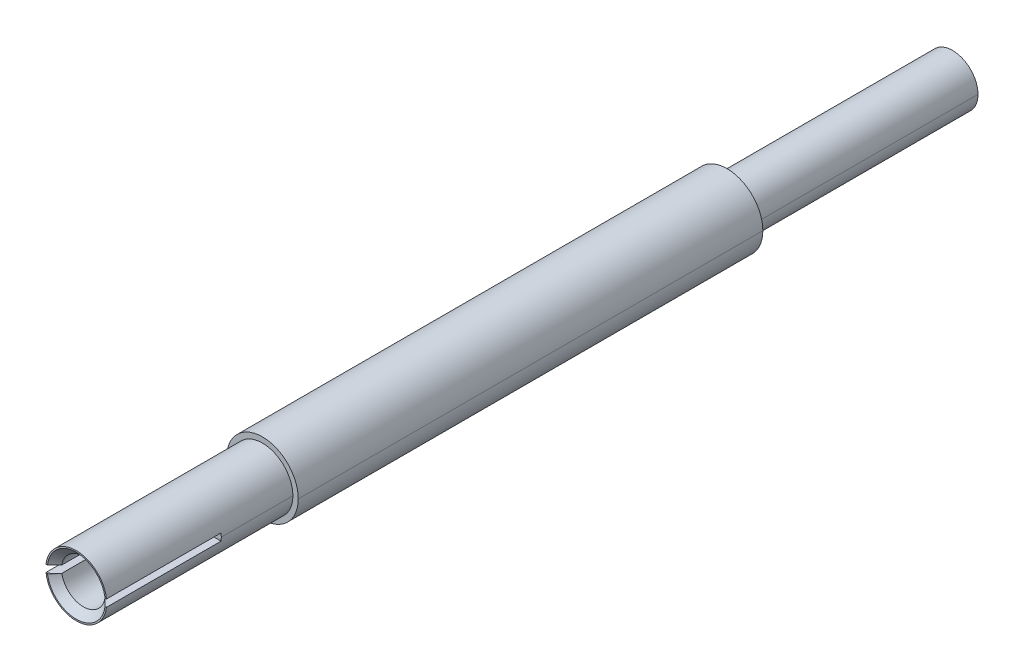
ISO-10303-21;
HEADER;
FILE_DESCRIPTION(('STEP AP214'),'2;1');
FILE_NAME('part.step','',(''),(''),'','','');
FILE_SCHEMA(('AUTOMOTIVE_DESIGN { 1 0 10303 214 1 1 1 1 }'));
ENDSEC;
DATA;
#1=APPLICATION_CONTEXT('core data for automotive mechanical design processes');
#2=APPLICATION_PROTOCOL_DEFINITION('international standard','automotive_design',2000,#1);
#3=PRODUCT_CONTEXT('',#1,'mechanical');
#4=PRODUCT('Part','Part','',(#3));
#5=PRODUCT_RELATED_PRODUCT_CATEGORY('part','',(#4));
#6=PRODUCT_DEFINITION_FORMATION('','',#4);
#7=PRODUCT_DEFINITION_CONTEXT('part definition',#1,'design');
#8=PRODUCT_DEFINITION('design','',#6,#7);
#9=PRODUCT_DEFINITION_SHAPE('','',#8);
#10=(LENGTH_UNIT() NAMED_UNIT(*) SI_UNIT(.MILLI.,.METRE.));
#11=(NAMED_UNIT(*) PLANE_ANGLE_UNIT() SI_UNIT($,.RADIAN.));
#12=(NAMED_UNIT(*) SI_UNIT($,.STERADIAN.) SOLID_ANGLE_UNIT());
#13=UNCERTAINTY_MEASURE_WITH_UNIT(LENGTH_MEASURE(1.E-05),#10,'distance_accuracy_value','');
#14=(GEOMETRIC_REPRESENTATION_CONTEXT(3) GLOBAL_UNCERTAINTY_ASSIGNED_CONTEXT((#13)) GLOBAL_UNIT_ASSIGNED_CONTEXT((#10,
#11,#12)) REPRESENTATION_CONTEXT('',''));
#15=CARTESIAN_POINT('',(0.,0.,0.));
#16=DIRECTION('',(0.,0.,1.));
#17=DIRECTION('',(1.,0.,0.));
#18=AXIS2_PLACEMENT_3D('',#15,#16,#17);
#19=CARTESIAN_POINT('',(0.,0.,7.1186));
#20=DIRECTION('',(0.,0.,1.));
#21=DIRECTION('',(1.,0.,0.));
#22=AXIS2_PLACEMENT_3D('',#19,#20,#21);
#23=CONICAL_SURFACE('',#22,0.38735,1.029744258677);
#24=DIRECTION('',(0.857167300702106,0.,0.515038074910064));
#25=VECTOR('',#24,1.);
#26=CARTESIAN_POINT('',(0.38735,0.,7.1186));
#27=LINE('',#26,#25);
#28=CARTESIAN_POINT('',(0.,0.,6.88585663922));
#29=VERTEX_POINT('',#28);
#30=CARTESIAN_POINT('',(0.38735,0.,7.1186));
#31=VERTEX_POINT('',#30);
#32=EDGE_CURVE('E41',#29,#31,#27,.T.);
#33=ORIENTED_EDGE('',*,*,#32,.F.);
#34=DIRECTION('',(-0.857167300702106,0.,0.515038074910064));
#35=VECTOR('',#34,1.);
#36=CARTESIAN_POINT('',(-0.38735,0.,7.1186));
#37=LINE('',#36,#35);
#38=CARTESIAN_POINT('',(-0.38735,0.,7.1186));
#39=VERTEX_POINT('',#38);
#40=EDGE_CURVE('E11',#29,#39,#37,.T.);
#41=ORIENTED_EDGE('',*,*,#40,.T.);
#42=CARTESIAN_POINT('',(0.,0.,7.1186));
#43=DIRECTION('',(0.,0.,1.));
#44=DIRECTION('',(1.,0.,0.));
#45=AXIS2_PLACEMENT_3D('',#42,#43,#44);
#46=CIRCLE('',#45,0.38735);
#47=EDGE_CURVE('E28',#39,#31,#46,.T.);
#48=ORIENTED_EDGE('',*,*,#47,.T.);
#49=EDGE_LOOP('',(#33,#41,#48));
#50=FACE_BOUND('',#49,.T.);
#51=ADVANCED_FACE('F17',(#50),#23,.F.);
#52=CARTESIAN_POINT('',(0.,0.,9.9126));
#53=DIRECTION('',(0.,0.,1.));
#54=DIRECTION('',(-0.98647123825125,-0.163934426229042,0.));
#55=AXIS2_PLACEMENT_3D('',#52,#53,#54);
#56=CONICAL_SURFACE('',#55,0.38735,0.785398163397);
#57=CARTESIAN_POINT('',(0.,0.,9.9126));
#58=DIRECTION('',(0.,0.,1.));
#59=DIRECTION('',(-0.98647123825125,-0.163934426229042,0.));
#60=AXIS2_PLACEMENT_3D('',#57,#58,#59);
#61=CIRCLE('',#60,0.38735);
#62=CARTESIAN_POINT('',(-0.382109634137,-0.0635,9.9126));
#63=VERTEX_POINT('',#62);
#64=CARTESIAN_POINT('',(0.382109634137,-0.0635,9.9126));
#65=VERTEX_POINT('',#64);
#66=EDGE_CURVE('E738',#63,#65,#61,.T.);
#67=ORIENTED_EDGE('',*,*,#66,.F.);
#68=DIRECTION('',(-0.697540502012791,-0.115919144455965,0.707106781186788));
#69=VECTOR('',#68,1.);
#70=CARTESIAN_POINT('',(-0.382109634137,-0.06349999999982,9.9126));
#71=LINE('',#70,#69);
#72=CARTESIAN_POINT('',(-0.507391481394,-0.08431967213089,10.0396));
#73=VERTEX_POINT('',#72);
#74=EDGE_CURVE('E257',#63,#73,#71,.T.);
#75=ORIENTED_EDGE('',*,*,#74,.T.);
#76=CARTESIAN_POINT('',(0.,0.,10.0396));
#77=DIRECTION('',(0.,0.,1.));
#78=DIRECTION('',(-0.98647123825125,-0.163934426229042,0.));
#79=AXIS2_PLACEMENT_3D('',#76,#77,#78);
#80=CIRCLE('',#79,0.51435);
#81=CARTESIAN_POINT('',(0.510415196188,-0.0635,10.0396));
#82=VERTEX_POINT('',#81);
#83=EDGE_CURVE('E260',#73,#82,#80,.T.);
#84=ORIENTED_EDGE('',*,*,#83,.T.);
#85=CARTESIAN_POINT('',(0.510415196188,-0.0635,10.0396));
#86=CARTESIAN_POINT('',(0.437226812203,-0.0635,9.96697151089599));
#87=CARTESIAN_POINT('',(0.382109634137,-0.0635,9.9126));
#88=(BOUNDED_CURVE() B_SPLINE_CURVE(2,(#85,#86,#87),.UNSPECIFIED.,.F.,
.F.) B_SPLINE_CURVE_WITH_KNOTS((3,3),(0.,1.),
.UNSPECIFIED.) CURVE() GEOMETRIC_REPRESENTATION_ITEM() RATIONAL_B_SPLINE_CURVE((1.,
1.010280016156,1.)) REPRESENTATION_ITEM(''));
#89=EDGE_CURVE('E320',#82,#65,#88,.T.);
#90=ORIENTED_EDGE('',*,*,#89,.T.);
#91=EDGE_LOOP('',(#67,#75,#84,#90));
#92=FACE_BOUND('',#91,.T.);
#93=ADVANCED_FACE('F536',(#92),#56,.F.);
#94=CARTESIAN_POINT('',(0.,0.,10.0396));
#95=DIRECTION('',(0.,0.,-1.));
#96=DIRECTION('',(1.,0.,0.));
#97=AXIS2_PLACEMENT_3D('',#94,#95,#96);
#98=CYLINDRICAL_SURFACE('',#97,0.38735);
#99=CARTESIAN_POINT('',(0.,0.,8.0076));
#100=DIRECTION('',(0.,0.,-1.));
#101=DIRECTION('',(1.,0.,0.));
#102=AXIS2_PLACEMENT_3D('',#99,#100,#101);
#103=CIRCLE('',#102,0.38735);
#104=CARTESIAN_POINT('',(-0.38735,0.,8.0076));
#105=VERTEX_POINT('',#104);
#106=CARTESIAN_POINT('',(-0.382109634137,0.0635,8.0076));
#107=VERTEX_POINT('',#106);
#108=EDGE_CURVE('E229',#105,#107,#103,.T.);
#109=ORIENTED_EDGE('',*,*,#108,.F.);
#110=DIRECTION('',(0.,0.,-1.));
#111=VECTOR('',#110,1.);
#112=CARTESIAN_POINT('',(-0.38735,0.,10.0396));
#113=LINE('',#112,#111);
#114=EDGE_CURVE('E255',#105,#39,#113,.T.);
#115=ORIENTED_EDGE('',*,*,#114,.T.);
#116=CARTESIAN_POINT('',(0.,0.,7.1186));
#117=DIRECTION('',(0.,0.,1.));
#118=DIRECTION('',(1.,0.,0.));
#119=AXIS2_PLACEMENT_3D('',#116,#117,#118);
#120=CIRCLE('',#119,0.38735);
#121=EDGE_CURVE('E364',#31,#39,#120,.T.);
#122=ORIENTED_EDGE('',*,*,#121,.F.);
#123=DIRECTION('',(0.,0.,-1.));
#124=VECTOR('',#123,1.);
#125=CARTESIAN_POINT('',(0.38735,0.,10.0396));
#126=LINE('',#125,#124);
#127=CARTESIAN_POINT('',(0.38735,0.,8.0076));
#128=VERTEX_POINT('',#127);
#129=EDGE_CURVE('E307',#128,#31,#126,.T.);
#130=ORIENTED_EDGE('',*,*,#129,.F.);
#131=CARTESIAN_POINT('',(0.,0.,8.0076));
#132=DIRECTION('',(0.,0.,-1.));
#133=DIRECTION('',(1.,0.,0.));
#134=AXIS2_PLACEMENT_3D('',#131,#132,#133);
#135=CIRCLE('',#134,0.38735);
#136=CARTESIAN_POINT('',(0.382109634137,0.0635,8.0076));
#137=VERTEX_POINT('',#136);
#138=EDGE_CURVE('E286',#137,#128,#135,.T.);
#139=ORIENTED_EDGE('',*,*,#138,.F.);
#140=DIRECTION('',(0.,0.,-1.));
#141=VECTOR('',#140,1.);
#142=CARTESIAN_POINT('',(0.382109634137,0.0635,10.0396));
#143=LINE('',#142,#141);
#144=CARTESIAN_POINT('',(0.382109634137,0.0635,9.9126));
#145=VERTEX_POINT('',#144);
#146=EDGE_CURVE('E268',#145,#137,#143,.T.);
#147=ORIENTED_EDGE('',*,*,#146,.F.);
#148=CARTESIAN_POINT('',(0.,0.,9.9126));
#149=DIRECTION('',(0.,0.,1.));
#150=DIRECTION('',(0.986471238251089,0.163934426230015,0.));
#151=AXIS2_PLACEMENT_3D('',#148,#149,#150);
#152=CIRCLE('',#151,0.38735);
#153=CARTESIAN_POINT('',(-0.382109634137,0.0635,9.9126));
#154=VERTEX_POINT('',#153);
#155=EDGE_CURVE('E248',#145,#154,#152,.T.);
#156=ORIENTED_EDGE('',*,*,#155,.T.);
#157=DIRECTION('',(0.,0.,-1.));
#158=VECTOR('',#157,1.);
#159=CARTESIAN_POINT('',(-0.382109634137,0.0635,10.0396));
#160=LINE('',#159,#158);
#161=EDGE_CURVE('E256',#154,#107,#160,.T.);
#162=ORIENTED_EDGE('',*,*,#161,.T.);
#163=EDGE_LOOP('',(#109,#115,#122,#130,#139,#147,#156,#162));
#164=FACE_BOUND('',#163,.T.);
#165=ADVANCED_FACE('F423',(#164),#98,.F.);
#166=CARTESIAN_POINT('',(0.,0.,6.7376));
#167=DIRECTION('',(0.,0.,1.));
#168=DIRECTION('',(1.,0.,0.));
#169=AXIS2_PLACEMENT_3D('',#166,#167,#168);
#170=CYLINDRICAL_SURFACE('',#169,0.53975);
#171=CARTESIAN_POINT('',(0.,0.,6.7376));
#172=DIRECTION('',(0.,0.,1.));
#173=DIRECTION('',(1.,0.,0.));
#174=AXIS2_PLACEMENT_3D('',#171,#172,#173);
#175=CIRCLE('',#174,0.53975);
#176=CARTESIAN_POINT('',(0.53975,0.,6.7376));
#177=VERTEX_POINT('',#176);
#178=CARTESIAN_POINT('',(-0.53975,0.,6.7376));
#179=VERTEX_POINT('',#178);
#180=EDGE_CURVE('E275',#177,#179,#175,.T.);
#181=ORIENTED_EDGE('',*,*,#180,.T.);
#182=DIRECTION('',(0.,0.,1.));
#183=VECTOR('',#182,1.);
#184=CARTESIAN_POINT('',(-0.53975,0.,6.7376));
#185=LINE('',#184,#183);
#186=CARTESIAN_POINT('',(-0.53975,0.,8.0076));
#187=VERTEX_POINT('',#186);
#188=EDGE_CURVE('E269',#179,#187,#185,.T.);
#189=ORIENTED_EDGE('',*,*,#188,.T.);
#190=CARTESIAN_POINT('',(0.,0.,8.0076));
#191=DIRECTION('',(0.,0.,1.));
#192=DIRECTION('',(1.,0.,0.));
#193=AXIS2_PLACEMENT_3D('',#190,#191,#192);
#194=CIRCLE('',#193,0.53975);
#195=CARTESIAN_POINT('',(-0.536001690762,0.0635,8.0076));
#196=VERTEX_POINT('',#195);
#197=EDGE_CURVE('E205',#196,#187,#194,.T.);
#198=ORIENTED_EDGE('',*,*,#197,.F.);
#199=DIRECTION('',(0.,0.,1.));
#200=VECTOR('',#199,1.);
#201=CARTESIAN_POINT('',(-0.536001690762,0.0635,6.7376));
#202=LINE('',#201,#200);
#203=CARTESIAN_POINT('',(-0.536001690762,0.06349999999998,10.0396));
#204=VERTEX_POINT('',#203);
#205=EDGE_CURVE('E21',#196,#204,#202,.T.);
#206=ORIENTED_EDGE('',*,*,#205,.T.);
#207=CARTESIAN_POINT('',(0.,0.,10.0396));
#208=DIRECTION('',(0.,0.,1.));
#209=DIRECTION('',(1.,0.,0.));
#210=AXIS2_PLACEMENT_3D('',#207,#208,#209);
#211=CIRCLE('',#210,0.53975);
#212=CARTESIAN_POINT('',(0.536001690762,0.06349999999999,10.0396));
#213=VERTEX_POINT('',#212);
#214=EDGE_CURVE('E353',#213,#204,#211,.T.);
#215=ORIENTED_EDGE('',*,*,#214,.F.);
#216=DIRECTION('',(0.,0.,1.));
#217=VECTOR('',#216,1.);
#218=CARTESIAN_POINT('',(0.536001690762,0.0635,6.7376));
#219=LINE('',#218,#217);
#220=CARTESIAN_POINT('',(0.536001690762,0.0635,8.0076));
#221=VERTEX_POINT('',#220);
#222=EDGE_CURVE('E276',#221,#213,#219,.T.);
#223=ORIENTED_EDGE('',*,*,#222,.F.);
#224=CARTESIAN_POINT('',(0.,0.,8.0076));
#225=DIRECTION('',(0.,0.,1.));
#226=DIRECTION('',(1.,0.,0.));
#227=AXIS2_PLACEMENT_3D('',#224,#225,#226);
#228=CIRCLE('',#227,0.53975);
#229=CARTESIAN_POINT('',(0.53975,0.,8.0076));
#230=VERTEX_POINT('',#229);
#231=EDGE_CURVE('E390',#230,#221,#228,.T.);
#232=ORIENTED_EDGE('',*,*,#231,.F.);
#233=DIRECTION('',(0.,0.,1.));
#234=VECTOR('',#233,1.);
#235=CARTESIAN_POINT('',(0.53975,0.,6.7376));
#236=LINE('',#235,#234);
#237=EDGE_CURVE('E327',#177,#230,#236,.T.);
#238=ORIENTED_EDGE('',*,*,#237,.F.);
#239=EDGE_LOOP('',(#181,#189,#198,#206,#215,#223,#232,#238));
#240=FACE_BOUND('',#239,.T.);
#241=ADVANCED_FACE('F434',(#240),#170,.T.);
#242=CARTESIAN_POINT('',(0.,0.,9.9126));
#243=DIRECTION('',(0.,0.,1.));
#244=DIRECTION('',(0.986471238251089,0.163934426230015,0.));
#245=AXIS2_PLACEMENT_3D('',#242,#243,#244);
#246=CONICAL_SURFACE('',#245,0.38735,0.785398163397);
#247=ORIENTED_EDGE('',*,*,#155,.F.);
#248=DIRECTION('',(0.69754050201271,0.115919144456952,0.707106781186706));
#249=VECTOR('',#248,1.);
#250=CARTESIAN_POINT('',(0.382109634137,0.0635000000002,9.9126));
#251=LINE('',#250,#249);
#252=CARTESIAN_POINT('',(0.507391481394,0.08431967213139,10.0396));
#253=VERTEX_POINT('',#252);
#254=EDGE_CURVE('E288',#145,#253,#251,.T.);
#255=ORIENTED_EDGE('',*,*,#254,.T.);
#256=CARTESIAN_POINT('',(0.,0.,10.0396));
#257=DIRECTION('',(0.,0.,1.));
#258=DIRECTION('',(0.986471238251089,0.163934426230015,0.));
#259=AXIS2_PLACEMENT_3D('',#256,#257,#258);
#260=CIRCLE('',#259,0.51435);
#261=CARTESIAN_POINT('',(-0.510415196188,0.0635,10.0396));
#262=VERTEX_POINT('',#261);
#263=EDGE_CURVE('E246',#253,#262,#260,.T.);
#264=ORIENTED_EDGE('',*,*,#263,.T.);
#265=CARTESIAN_POINT('',(-0.510415196188,0.0635,10.0396));
#266=CARTESIAN_POINT('',(-0.437226812204,0.0635,9.96697151089699));
#267=CARTESIAN_POINT('',(-0.382109634137,0.0635,9.9126));
#268=(BOUNDED_CURVE() B_SPLINE_CURVE(2,(#265,#266,#267),.UNSPECIFIED.,.F.,
.F.) B_SPLINE_CURVE_WITH_KNOTS((3,3),(0.,1.),
.UNSPECIFIED.) CURVE() GEOMETRIC_REPRESENTATION_ITEM() RATIONAL_B_SPLINE_CURVE((1.,
1.010280016141,1.)) REPRESENTATION_ITEM(''));
#269=EDGE_CURVE('E240',#262,#154,#268,.T.);
#270=ORIENTED_EDGE('',*,*,#269,.T.);
#271=EDGE_LOOP('',(#247,#255,#264,#270));
#272=FACE_BOUND('',#271,.T.);
#273=ADVANCED_FACE('F428',(#272),#246,.F.);
#274=CARTESIAN_POINT('',(0.,0.,-1.5));
#275=DIRECTION('',(0.,0.,1.));
#276=DIRECTION('',(-1.,0.,0.));
#277=AXIS2_PLACEMENT_3D('',#274,#275,#276);
#278=CYLINDRICAL_SURFACE('',#277,0.635);
#279=CARTESIAN_POINT('',(0.,0.,-1.5));
#280=DIRECTION('',(0.,0.,1.));
#281=DIRECTION('',(-1.,0.,0.));
#282=AXIS2_PLACEMENT_3D('',#279,#280,#281);
#283=CIRCLE('',#282,0.635);
#284=CARTESIAN_POINT('',(-0.635,0.,-1.5));
#285=VERTEX_POINT('',#284);
#286=CARTESIAN_POINT('',(0.635,0.,-1.5));
#287=VERTEX_POINT('',#286);
#288=EDGE_CURVE('E247',#285,#287,#283,.T.);
#289=ORIENTED_EDGE('',*,*,#288,.T.);
#290=DIRECTION('',(0.,0.,1.));
#291=VECTOR('',#290,1.);
#292=CARTESIAN_POINT('',(0.635,0.,-1.5));
#293=LINE('',#292,#291);
#294=CARTESIAN_POINT('',(0.635,0.,6.7376));
#295=VERTEX_POINT('',#294);
#296=EDGE_CURVE('E297',#287,#295,#293,.T.);
#297=ORIENTED_EDGE('',*,*,#296,.T.);
#298=CARTESIAN_POINT('',(0.,0.,6.7376));
#299=DIRECTION('',(0.,0.,1.));
#300=DIRECTION('',(1.,0.,0.));
#301=AXIS2_PLACEMENT_3D('',#298,#299,#300);
#302=CIRCLE('',#301,0.635);
#303=CARTESIAN_POINT('',(-0.635,0.,6.7376));
#304=VERTEX_POINT('',#303);
#305=EDGE_CURVE('E239',#304,#295,#302,.T.);
#306=ORIENTED_EDGE('',*,*,#305,.F.);
#307=DIRECTION('',(0.,0.,1.));
#308=VECTOR('',#307,1.);
#309=CARTESIAN_POINT('',(-0.635,0.,-1.5));
#310=LINE('',#309,#308);
#311=EDGE_CURVE('E235',#285,#304,#310,.T.);
#312=ORIENTED_EDGE('',*,*,#311,.F.);
#313=EDGE_LOOP('',(#289,#297,#306,#312));
#314=FACE_BOUND('',#313,.T.);
#315=ADVANCED_FACE('F450',(#314),#278,.T.);
#316=CARTESIAN_POINT('',(0.,0.,-1.5));
#317=DIRECTION('',(0.,0.,-1.));
#318=DIRECTION('',(1.,0.,0.));
#319=AXIS2_PLACEMENT_3D('',#316,#317,#318);
#320=CYLINDRICAL_SURFACE('',#319,0.45);
#321=CARTESIAN_POINT('',(0.,0.,-1.5));
#322=DIRECTION('',(0.,0.,-1.));
#323=DIRECTION('',(1.,0.,0.));
#324=AXIS2_PLACEMENT_3D('',#321,#322,#323);
#325=CIRCLE('',#324,0.45);
#326=CARTESIAN_POINT('',(0.45,0.,-1.5));
#327=VERTEX_POINT('',#326);
#328=CARTESIAN_POINT('',(-0.45,0.,-1.5));
#329=VERTEX_POINT('',#328);
#330=EDGE_CURVE('E357',#327,#329,#325,.T.);
#331=ORIENTED_EDGE('',*,*,#330,.T.);
#332=DIRECTION('',(0.,0.,-1.));
#333=VECTOR('',#332,1.);
#334=CARTESIAN_POINT('',(-0.45,0.,-1.5));
#335=LINE('',#334,#333);
#336=CARTESIAN_POINT('',(-0.45,0.,-5.5));
#337=VERTEX_POINT('',#336);
#338=EDGE_CURVE('E405',#329,#337,#335,.T.);
#339=ORIENTED_EDGE('',*,*,#338,.T.);
#340=CARTESIAN_POINT('',(0.,0.,-5.5));
#341=DIRECTION('',(0.,0.,-1.));
#342=DIRECTION('',(1.,0.,0.));
#343=AXIS2_PLACEMENT_3D('',#340,#341,#342);
#344=CIRCLE('',#343,0.45);
#345=CARTESIAN_POINT('',(0.45,0.,-5.5));
#346=VERTEX_POINT('',#345);
#347=EDGE_CURVE('E315',#346,#337,#344,.T.);
#348=ORIENTED_EDGE('',*,*,#347,.F.);
#349=DIRECTION('',(0.,0.,-1.));
#350=VECTOR('',#349,1.);
#351=CARTESIAN_POINT('',(0.45,0.,-1.5));
#352=LINE('',#351,#350);
#353=EDGE_CURVE('E306',#327,#346,#352,.T.);
#354=ORIENTED_EDGE('',*,*,#353,.F.);
#355=EDGE_LOOP('',(#331,#339,#348,#354));
#356=FACE_BOUND('',#355,.T.);
#357=ADVANCED_FACE('F455',(#356),#320,.T.);
#358=CARTESIAN_POINT('',(0.,0.,-5.5));
#359=DIRECTION('',(0.,0.,-1.));
#360=DIRECTION('',(-1.,0.,0.));
#361=AXIS2_PLACEMENT_3D('',#358,#359,#360);
#362=PLANE('',#361);
#363=ORIENTED_EDGE('',*,*,#347,.T.);
#364=CARTESIAN_POINT('',(0.,0.,-5.5));
#365=DIRECTION('',(0.,0.,-1.));
#366=DIRECTION('',(1.,0.,0.));
#367=AXIS2_PLACEMENT_3D('',#364,#365,#366);
#368=CIRCLE('',#367,0.45);
#369=EDGE_CURVE('E305',#337,#346,#368,.T.);
#370=ORIENTED_EDGE('',*,*,#369,.T.);
#371=EDGE_LOOP('',(#363,#370));
#372=FACE_BOUND('',#371,.T.);
#373=ADVANCED_FACE('F461',(#372),#362,.T.);
#374=CARTESIAN_POINT('',(0.,0.,-1.5));
#375=DIRECTION('',(0.,0.,-1.));
#376=DIRECTION('',(1.,0.,0.));
#377=AXIS2_PLACEMENT_3D('',#374,#375,#376);
#378=CYLINDRICAL_SURFACE('',#377,0.45);
#379=ORIENTED_EDGE('',*,*,#338,.F.);
#380=CARTESIAN_POINT('',(0.,0.,-1.5));
#381=DIRECTION('',(0.,0.,-1.));
#382=DIRECTION('',(1.,0.,0.));
#383=AXIS2_PLACEMENT_3D('',#380,#381,#382);
#384=CIRCLE('',#383,0.45);
#385=EDGE_CURVE('E301',#329,#327,#384,.T.);
#386=ORIENTED_EDGE('',*,*,#385,.T.);
#387=ORIENTED_EDGE('',*,*,#353,.T.);
#388=ORIENTED_EDGE('',*,*,#369,.F.);
#389=EDGE_LOOP('',(#379,#386,#387,#388));
#390=FACE_BOUND('',#389,.T.);
#391=ADVANCED_FACE('F19',(#390),#378,.T.);
#392=CARTESIAN_POINT('',(0.,0.,-1.5));
#393=DIRECTION('',(0.,0.,1.));
#394=DIRECTION('',(1.,0.,0.));
#395=AXIS2_PLACEMENT_3D('',#392,#393,#394);
#396=PLANE('',#395);
#397=ORIENTED_EDGE('',*,*,#288,.F.);
#398=CARTESIAN_POINT('',(0.,0.,-1.5));
#399=DIRECTION('',(0.,0.,1.));
#400=DIRECTION('',(-1.,0.,0.));
#401=AXIS2_PLACEMENT_3D('',#398,#399,#400);
#402=CIRCLE('',#401,0.635);
#403=EDGE_CURVE('E238',#287,#285,#402,.T.);
#404=ORIENTED_EDGE('',*,*,#403,.F.);
#405=EDGE_LOOP('',(#397,#404));
#406=FACE_BOUND('',#405,.T.);
#407=ORIENTED_EDGE('',*,*,#330,.F.);
#408=ORIENTED_EDGE('',*,*,#385,.F.);
#409=EDGE_LOOP('',(#407,#408));
#410=FACE_BOUND('',#409,.T.);
#411=ADVANCED_FACE('F497',(#406,#410),#396,.F.);
#412=CARTESIAN_POINT('',(0.,0.,-1.5));
#413=DIRECTION('',(0.,0.,1.));
#414=DIRECTION('',(-1.,0.,0.));
#415=AXIS2_PLACEMENT_3D('',#412,#413,#414);
#416=CYLINDRICAL_SURFACE('',#415,0.635);
#417=ORIENTED_EDGE('',*,*,#296,.F.);
#418=ORIENTED_EDGE('',*,*,#403,.T.);
#419=ORIENTED_EDGE('',*,*,#311,.T.);
#420=CARTESIAN_POINT('',(0.,0.,6.7376));
#421=DIRECTION('',(0.,0.,1.));
#422=DIRECTION('',(1.,0.,0.));
#423=AXIS2_PLACEMENT_3D('',#420,#421,#422);
#424=CIRCLE('',#423,0.635);
#425=EDGE_CURVE('E342',#295,#304,#424,.T.);
#426=ORIENTED_EDGE('',*,*,#425,.F.);
#427=EDGE_LOOP('',(#417,#418,#419,#426));
#428=FACE_BOUND('',#427,.T.);
#429=ADVANCED_FACE('F501',(#428),#416,.T.);
#430=CARTESIAN_POINT('',(0.,0.,6.7376));
#431=DIRECTION('',(0.,0.,1.));
#432=DIRECTION('',(1.,0.,0.));
#433=AXIS2_PLACEMENT_3D('',#430,#431,#432);
#434=PLANE('',#433);
#435=ORIENTED_EDGE('',*,*,#180,.F.);
#436=CARTESIAN_POINT('',(0.,0.,6.7376));
#437=DIRECTION('',(0.,0.,1.));
#438=DIRECTION('',(1.,0.,0.));
#439=AXIS2_PLACEMENT_3D('',#436,#437,#438);
#440=CIRCLE('',#439,0.53975);
#441=EDGE_CURVE('E365',#179,#177,#440,.T.);
#442=ORIENTED_EDGE('',*,*,#441,.F.);
#443=EDGE_LOOP('',(#435,#442));
#444=FACE_BOUND('',#443,.T.);
#445=ORIENTED_EDGE('',*,*,#305,.T.);
#446=ORIENTED_EDGE('',*,*,#425,.T.);
#447=EDGE_LOOP('',(#445,#446));
#448=FACE_BOUND('',#447,.T.);
#449=ADVANCED_FACE('F507',(#444,#448),#434,.T.);
#450=CARTESIAN_POINT('',(0.,0.,7.1186));
#451=DIRECTION('',(0.,0.,1.));
#452=DIRECTION('',(1.,0.,0.));
#453=AXIS2_PLACEMENT_3D('',#450,#451,#452);
#454=CONICAL_SURFACE('',#453,0.38735,1.029744258677);
#455=ORIENTED_EDGE('',*,*,#40,.F.);
#456=ORIENTED_EDGE('',*,*,#32,.T.);
#457=ORIENTED_EDGE('',*,*,#121,.T.);
#458=EDGE_LOOP('',(#455,#456,#457));
#459=FACE_BOUND('',#458,.T.);
#460=ADVANCED_FACE('F512',(#459),#454,.F.);
#461=CARTESIAN_POINT('',(0.,0.,9.9126));
#462=DIRECTION('',(0.,0.,1.));
#463=DIRECTION('',(-0.98647123825125,-0.163934426229042,0.));
#464=AXIS2_PLACEMENT_3D('',#461,#462,#463);
#465=CONICAL_SURFACE('',#464,0.38735,0.785398163397);
#466=ORIENTED_EDGE('',*,*,#74,.F.);
#467=CARTESIAN_POINT('',(-0.510415196188,-0.0635,10.0396));
#468=CARTESIAN_POINT('',(-0.437226812204,-0.0635,9.96697151089699));
#469=CARTESIAN_POINT('',(-0.382109634137,-0.0635,9.9126));
#470=(BOUNDED_CURVE() B_SPLINE_CURVE(2,(#467,#468,#469),.UNSPECIFIED.,.F.,
.F.) B_SPLINE_CURVE_WITH_KNOTS((3,3),(0.,1.),
.UNSPECIFIED.) CURVE() GEOMETRIC_REPRESENTATION_ITEM() RATIONAL_B_SPLINE_CURVE((1.,
1.010280016141,1.)) REPRESENTATION_ITEM(''));
#471=CARTESIAN_POINT('',(-0.510415196188,-0.0635,10.0396));
#472=VERTEX_POINT('',#471);
#473=EDGE_CURVE('E331',#472,#63,#470,.T.);
#474=ORIENTED_EDGE('',*,*,#473,.F.);
#475=CARTESIAN_POINT('',(0.,0.,10.0396));
#476=DIRECTION('',(0.,0.,1.));
#477=DIRECTION('',(-0.98647123825125,-0.163934426229042,0.));
#478=AXIS2_PLACEMENT_3D('',#475,#476,#477);
#479=CIRCLE('',#478,0.51435);
#480=EDGE_CURVE('E372',#472,#73,#479,.T.);
#481=ORIENTED_EDGE('',*,*,#480,.T.);
#482=EDGE_LOOP('',(#466,#474,#481));
#483=FACE_BOUND('',#482,.T.);
#484=ADVANCED_FACE('F576',(#483),#465,.F.);
#485=CARTESIAN_POINT('',(0.635,-0.0635,10.0396));
#486=DIRECTION('',(0.,1.,0.));
#487=DIRECTION('',(0.,0.,-1.));
#488=AXIS2_PLACEMENT_3D('',#485,#486,#487);
#489=PLANE('',#488);
#490=DIRECTION('',(-1.,0.,0.));
#491=VECTOR('',#490,1.);
#492=CARTESIAN_POINT('',(0.635,-0.0635,10.0396));
#493=LINE('',#492,#491);
#494=CARTESIAN_POINT('',(0.536001690762,-0.06349999999999,10.0396));
#495=VERTEX_POINT('',#494);
#496=EDGE_CURVE('E336',#495,#82,#493,.T.);
#497=ORIENTED_EDGE('',*,*,#496,.F.);
#498=DIRECTION('',(0.,0.,1.));
#499=VECTOR('',#498,1.);
#500=CARTESIAN_POINT('',(0.536001690762,-0.0635,6.7376));
#501=LINE('',#500,#499);
#502=CARTESIAN_POINT('',(0.536001690762,-0.0635,8.0076));
#503=VERTEX_POINT('',#502);
#504=EDGE_CURVE('E324',#503,#495,#501,.T.);
#505=ORIENTED_EDGE('',*,*,#504,.F.);
#506=DIRECTION('',(-1.,0.,0.));
#507=VECTOR('',#506,1.);
#508=CARTESIAN_POINT('',(0.635,-0.0635,8.0076));
#509=LINE('',#508,#507);
#510=CARTESIAN_POINT('',(0.382109634137,-0.0635,8.0076));
#511=VERTEX_POINT('',#510);
#512=EDGE_CURVE('E361',#503,#511,#509,.T.);
#513=ORIENTED_EDGE('',*,*,#512,.T.);
#514=DIRECTION('',(0.,0.,-1.));
#515=VECTOR('',#514,1.);
#516=CARTESIAN_POINT('',(0.382109634137,-0.0635,10.0396));
#517=LINE('',#516,#515);
#518=EDGE_CURVE('E311',#65,#511,#517,.T.);
#519=ORIENTED_EDGE('',*,*,#518,.F.);
#520=ORIENTED_EDGE('',*,*,#89,.F.);
#521=EDGE_LOOP('',(#497,#505,#513,#519,#520));
#522=FACE_BOUND('',#521,.T.);
#523=ADVANCED_FACE('F553',(#522),#489,.T.);
#524=CARTESIAN_POINT('',(0.,0.,10.0396));
#525=DIRECTION('',(0.,0.,1.));
#526=DIRECTION('',(1.,0.,0.));
#527=AXIS2_PLACEMENT_3D('',#524,#525,#526);
#528=PLANE('',#527);
#529=DIRECTION('',(-1.,0.,0.));
#530=VECTOR('',#529,1.);
#531=CARTESIAN_POINT('',(0.635,-0.0635,10.0396));
#532=LINE('',#531,#530);
#533=CARTESIAN_POINT('',(-0.536001690762,-0.06349999999998,10.0396));
#534=VERTEX_POINT('',#533);
#535=EDGE_CURVE('E358',#472,#534,#532,.T.);
#536=ORIENTED_EDGE('',*,*,#535,.T.);
#537=CARTESIAN_POINT('',(0.,0.,10.0396));
#538=DIRECTION('',(0.,0.,1.));
#539=DIRECTION('',(1.,0.,0.));
#540=AXIS2_PLACEMENT_3D('',#537,#538,#539);
#541=CIRCLE('',#540,0.53975);
#542=EDGE_CURVE('E199',#534,#495,#541,.T.);
#543=ORIENTED_EDGE('',*,*,#542,.T.);
#544=ORIENTED_EDGE('',*,*,#496,.T.);
#545=ORIENTED_EDGE('',*,*,#83,.F.);
#546=ORIENTED_EDGE('',*,*,#480,.F.);
#547=EDGE_LOOP('',(#536,#543,#544,#545,#546));
#548=FACE_BOUND('',#547,.T.);
#549=ADVANCED_FACE('F549',(#548),#528,.T.);
#550=CARTESIAN_POINT('',(0.635,-0.0635,10.0396));
#551=DIRECTION('',(0.,1.,0.));
#552=DIRECTION('',(0.,0.,-1.));
#553=AXIS2_PLACEMENT_3D('',#550,#551,#552);
#554=PLANE('',#553);
#555=ORIENTED_EDGE('',*,*,#535,.F.);
#556=ORIENTED_EDGE('',*,*,#473,.T.);
#557=DIRECTION('',(0.,0.,-1.));
#558=VECTOR('',#557,1.);
#559=CARTESIAN_POINT('',(-0.382109634137,-0.0635,10.0396));
#560=LINE('',#559,#558);
#561=CARTESIAN_POINT('',(-0.382109634137,-0.0635,8.0076));
#562=VERTEX_POINT('',#561);
#563=EDGE_CURVE('E211',#63,#562,#560,.T.);
#564=ORIENTED_EDGE('',*,*,#563,.T.);
#565=DIRECTION('',(-1.,0.,0.));
#566=VECTOR('',#565,1.);
#567=CARTESIAN_POINT('',(0.635,-0.0635,8.0076));
#568=LINE('',#567,#566);
#569=CARTESIAN_POINT('',(-0.536001690762,-0.0635,8.0076));
#570=VERTEX_POINT('',#569);
#571=EDGE_CURVE('E204',#562,#570,#568,.T.);
#572=ORIENTED_EDGE('',*,*,#571,.T.);
#573=DIRECTION('',(0.,0.,1.));
#574=VECTOR('',#573,1.);
#575=CARTESIAN_POINT('',(-0.536001690762,-0.0635,6.7376));
#576=LINE('',#575,#574);
#577=EDGE_CURVE('E193',#570,#534,#576,.T.);
#578=ORIENTED_EDGE('',*,*,#577,.T.);
#579=EDGE_LOOP('',(#555,#556,#564,#572,#578));
#580=FACE_BOUND('',#579,.T.);
#581=ADVANCED_FACE('F208',(#580),#554,.T.);
#582=CARTESIAN_POINT('',(0.,0.,8.0076));
#583=DIRECTION('',(0.,0.,1.));
#584=DIRECTION('',(1.,0.,0.));
#585=AXIS2_PLACEMENT_3D('',#582,#583,#584);
#586=PLANE('',#585);
#587=DIRECTION('',(1.,0.,0.));
#588=VECTOR('',#587,1.);
#589=CARTESIAN_POINT('',(-0.635,0.0635,8.0076));
#590=LINE('',#589,#588);
#591=EDGE_CURVE('E312',#196,#107,#590,.T.);
#592=ORIENTED_EDGE('',*,*,#591,.F.);
#593=ORIENTED_EDGE('',*,*,#197,.T.);
#594=CARTESIAN_POINT('',(0.,0.,8.0076));
#595=DIRECTION('',(0.,0.,1.));
#596=DIRECTION('',(1.,0.,0.));
#597=AXIS2_PLACEMENT_3D('',#594,#595,#596);
#598=CIRCLE('',#597,0.53975);
#599=EDGE_CURVE('E197',#187,#570,#598,.T.);
#600=ORIENTED_EDGE('',*,*,#599,.T.);
#601=ORIENTED_EDGE('',*,*,#571,.F.);
#602=CARTESIAN_POINT('',(0.,0.,8.0076));
#603=DIRECTION('',(0.,0.,-1.));
#604=DIRECTION('',(1.,0.,0.));
#605=AXIS2_PLACEMENT_3D('',#602,#603,#604);
#606=CIRCLE('',#605,0.38735);
#607=EDGE_CURVE('E221',#562,#105,#606,.T.);
#608=ORIENTED_EDGE('',*,*,#607,.T.);
#609=ORIENTED_EDGE('',*,*,#108,.T.);
#610=EDGE_LOOP('',(#592,#593,#600,#601,#608,#609));
#611=FACE_BOUND('',#610,.T.);
#612=ADVANCED_FACE('F218',(#611),#586,.T.);
#613=CARTESIAN_POINT('',(0.,0.,8.0076));
#614=DIRECTION('',(0.,0.,1.));
#615=DIRECTION('',(1.,0.,0.));
#616=AXIS2_PLACEMENT_3D('',#613,#614,#615);
#617=PLANE('',#616);
#618=DIRECTION('',(1.,0.,0.));
#619=VECTOR('',#618,1.);
#620=CARTESIAN_POINT('',(-0.635,0.0635,8.0076));
#621=LINE('',#620,#619);
#622=EDGE_CURVE('E280',#137,#221,#621,.T.);
#623=ORIENTED_EDGE('',*,*,#622,.F.);
#624=ORIENTED_EDGE('',*,*,#138,.T.);
#625=CARTESIAN_POINT('',(0.,0.,8.0076));
#626=DIRECTION('',(0.,0.,-1.));
#627=DIRECTION('',(1.,0.,0.));
#628=AXIS2_PLACEMENT_3D('',#625,#626,#627);
#629=CIRCLE('',#628,0.38735);
#630=EDGE_CURVE('E282',#128,#511,#629,.T.);
#631=ORIENTED_EDGE('',*,*,#630,.T.);
#632=ORIENTED_EDGE('',*,*,#512,.F.);
#633=CARTESIAN_POINT('',(0.,0.,8.0076));
#634=DIRECTION('',(0.,0.,1.));
#635=DIRECTION('',(1.,0.,0.));
#636=AXIS2_PLACEMENT_3D('',#633,#634,#635);
#637=CIRCLE('',#636,0.53975);
#638=EDGE_CURVE('E287',#503,#230,#637,.T.);
#639=ORIENTED_EDGE('',*,*,#638,.T.);
#640=ORIENTED_EDGE('',*,*,#231,.T.);
#641=EDGE_LOOP('',(#623,#624,#631,#632,#639,#640));
#642=FACE_BOUND('',#641,.T.);
#643=ADVANCED_FACE('F476',(#642),#617,.T.);
#644=CARTESIAN_POINT('',(0.,0.,10.0396));
#645=DIRECTION('',(0.,0.,-1.));
#646=DIRECTION('',(1.,0.,0.));
#647=AXIS2_PLACEMENT_3D('',#644,#645,#646);
#648=CYLINDRICAL_SURFACE('',#647,0.38735);
#649=ORIENTED_EDGE('',*,*,#114,.F.);
#650=ORIENTED_EDGE('',*,*,#607,.F.);
#651=ORIENTED_EDGE('',*,*,#563,.F.);
#652=ORIENTED_EDGE('',*,*,#66,.T.);
#653=ORIENTED_EDGE('',*,*,#518,.T.);
#654=ORIENTED_EDGE('',*,*,#630,.F.);
#655=ORIENTED_EDGE('',*,*,#129,.T.);
#656=ORIENTED_EDGE('',*,*,#47,.F.);
#657=EDGE_LOOP('',(#649,#650,#651,#652,#653,#654,#655,#656));
#658=FACE_BOUND('',#657,.T.);
#659=ADVANCED_FACE('F485',(#658),#648,.F.);
#660=CARTESIAN_POINT('',(-0.635,0.0635,10.0396));
#661=DIRECTION('',(0.,-1.,0.));
#662=DIRECTION('',(-1.,0.,0.));
#663=AXIS2_PLACEMENT_3D('',#660,#661,#662);
#664=PLANE('',#663);
#665=DIRECTION('',(1.,0.,0.));
#666=VECTOR('',#665,1.);
#667=CARTESIAN_POINT('',(-0.635,0.0635,10.0396));
#668=LINE('',#667,#666);
#669=EDGE_CURVE('E349',#204,#262,#668,.T.);
#670=ORIENTED_EDGE('',*,*,#669,.F.);
#671=ORIENTED_EDGE('',*,*,#205,.F.);
#672=ORIENTED_EDGE('',*,*,#591,.T.);
#673=ORIENTED_EDGE('',*,*,#161,.F.);
#674=ORIENTED_EDGE('',*,*,#269,.F.);
#675=EDGE_LOOP('',(#670,#671,#672,#673,#674));
#676=FACE_BOUND('',#675,.T.);
#677=ADVANCED_FACE('F419',(#676),#664,.T.);
#678=CARTESIAN_POINT('',(0.,0.,6.7376));
#679=DIRECTION('',(0.,0.,1.));
#680=DIRECTION('',(1.,0.,0.));
#681=AXIS2_PLACEMENT_3D('',#678,#679,#680);
#682=CYLINDRICAL_SURFACE('',#681,0.53975);
#683=ORIENTED_EDGE('',*,*,#188,.F.);
#684=ORIENTED_EDGE('',*,*,#441,.T.);
#685=ORIENTED_EDGE('',*,*,#237,.T.);
#686=ORIENTED_EDGE('',*,*,#638,.F.);
#687=ORIENTED_EDGE('',*,*,#504,.T.);
#688=ORIENTED_EDGE('',*,*,#542,.F.);
#689=ORIENTED_EDGE('',*,*,#577,.F.);
#690=ORIENTED_EDGE('',*,*,#599,.F.);
#691=EDGE_LOOP('',(#683,#684,#685,#686,#687,#688,#689,#690));
#692=FACE_BOUND('',#691,.T.);
#693=ADVANCED_FACE('F195',(#692),#682,.T.);
#694=CARTESIAN_POINT('',(0.,0.,9.9126));
#695=DIRECTION('',(0.,0.,1.));
#696=DIRECTION('',(0.986471238251089,0.163934426230015,0.));
#697=AXIS2_PLACEMENT_3D('',#694,#695,#696);
#698=CONICAL_SURFACE('',#697,0.38735,0.785398163397);
#699=ORIENTED_EDGE('',*,*,#254,.F.);
#700=CARTESIAN_POINT('',(0.510415196188,0.0635,10.0396));
#701=CARTESIAN_POINT('',(0.437226812203,0.0635,9.96697151089599));
#702=CARTESIAN_POINT('',(0.382109634137,0.0635,9.9126));
#703=(BOUNDED_CURVE() B_SPLINE_CURVE(2,(#700,#701,#702),.UNSPECIFIED.,.F.,
.F.) B_SPLINE_CURVE_WITH_KNOTS((3,3),(0.,1.),
.UNSPECIFIED.) CURVE() GEOMETRIC_REPRESENTATION_ITEM() RATIONAL_B_SPLINE_CURVE((1.,
1.010280016156,1.)) REPRESENTATION_ITEM(''));
#704=CARTESIAN_POINT('',(0.510415196188,0.0635,10.0396));
#705=VERTEX_POINT('',#704);
#706=EDGE_CURVE('E262',#705,#145,#703,.T.);
#707=ORIENTED_EDGE('',*,*,#706,.F.);
#708=CARTESIAN_POINT('',(0.,0.,10.0396));
#709=DIRECTION('',(0.,0.,1.));
#710=DIRECTION('',(0.986471238251089,0.163934426230015,0.));
#711=AXIS2_PLACEMENT_3D('',#708,#709,#710);
#712=CIRCLE('',#711,0.51435);
#713=EDGE_CURVE('E233',#705,#253,#712,.T.);
#714=ORIENTED_EDGE('',*,*,#713,.T.);
#715=EDGE_LOOP('',(#699,#707,#714));
#716=FACE_BOUND('',#715,.T.);
#717=ADVANCED_FACE('F443',(#716),#698,.F.);
#718=CARTESIAN_POINT('',(-0.635,0.0635,10.0396));
#719=DIRECTION('',(0.,-1.,0.));
#720=DIRECTION('',(-1.,0.,0.));
#721=AXIS2_PLACEMENT_3D('',#718,#719,#720);
#722=PLANE('',#721);
#723=DIRECTION('',(1.,0.,0.));
#724=VECTOR('',#723,1.);
#725=CARTESIAN_POINT('',(-0.635,0.0635,10.0396));
#726=LINE('',#725,#724);
#727=EDGE_CURVE('E281',#705,#213,#726,.T.);
#728=ORIENTED_EDGE('',*,*,#727,.F.);
#729=ORIENTED_EDGE('',*,*,#706,.T.);
#730=ORIENTED_EDGE('',*,*,#146,.T.);
#731=ORIENTED_EDGE('',*,*,#622,.T.);
#732=ORIENTED_EDGE('',*,*,#222,.T.);
#733=EDGE_LOOP('',(#728,#729,#730,#731,#732));
#734=FACE_BOUND('',#733,.T.);
#735=ADVANCED_FACE('F528',(#734),#722,.T.);
#736=CARTESIAN_POINT('',(0.,0.,10.0396));
#737=DIRECTION('',(0.,0.,1.));
#738=DIRECTION('',(1.,0.,0.));
#739=AXIS2_PLACEMENT_3D('',#736,#737,#738);
#740=PLANE('',#739);
#741=ORIENTED_EDGE('',*,*,#727,.T.);
#742=ORIENTED_EDGE('',*,*,#214,.T.);
#743=ORIENTED_EDGE('',*,*,#669,.T.);
#744=ORIENTED_EDGE('',*,*,#263,.F.);
#745=ORIENTED_EDGE('',*,*,#713,.F.);
#746=EDGE_LOOP('',(#741,#742,#743,#744,#745));
#747=FACE_BOUND('',#746,.T.);
#748=ADVANCED_FACE('F430',(#747),#740,.T.);
#749=CLOSED_SHELL('',(#51,#93,#165,#241,#273,#315,#357,#373,#391,#411,#429,#449,#460,#484,#523,
#549,#581,#612,#643,#659,#677,#693,#717,#735,#748));
#750=MANIFOLD_SOLID_BREP('B1',#749);
#751=ADVANCED_BREP_SHAPE_REPRESENTATION('',(#18,#750),#14);
#752=SHAPE_DEFINITION_REPRESENTATION(#9,#751);
ENDSEC;
END-ISO-10303-21;
